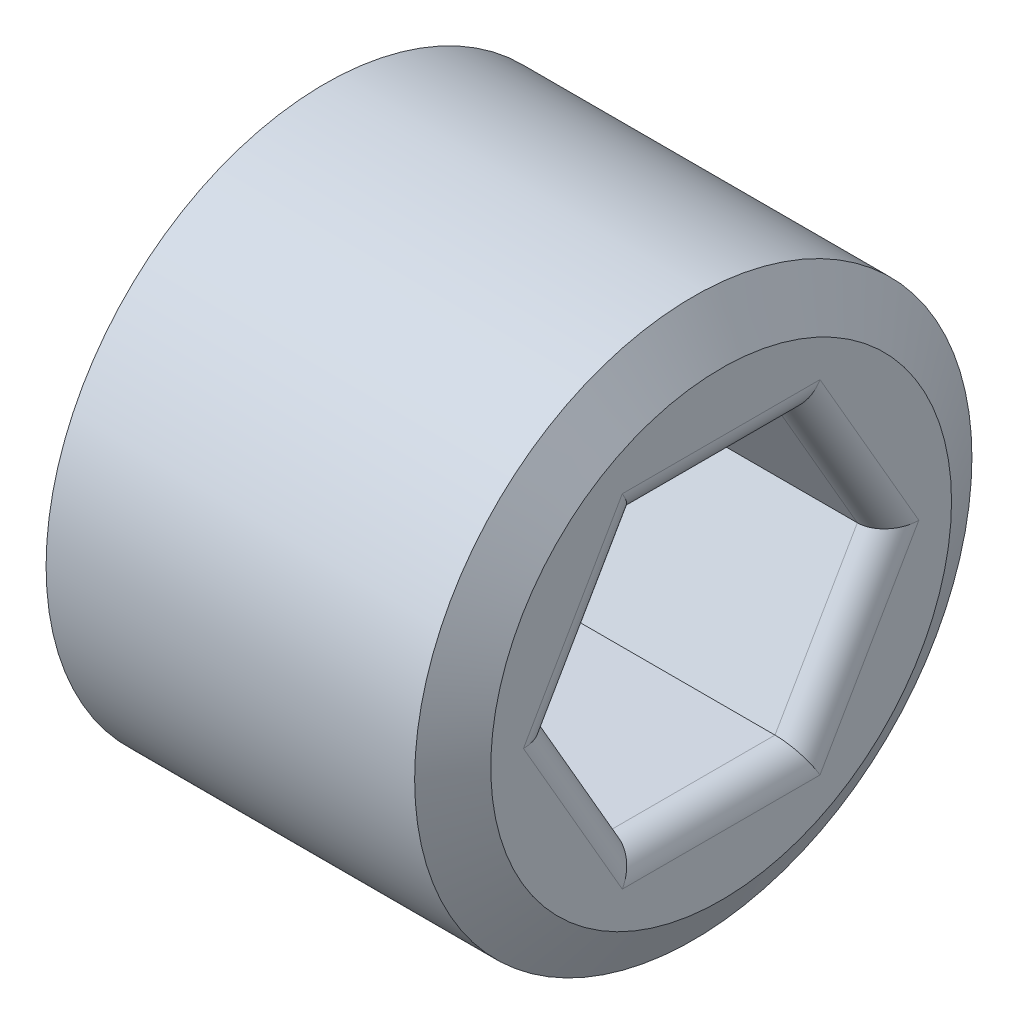
ISO-10303-21;
HEADER;
FILE_DESCRIPTION(('STEP AP214'),'2;1');
FILE_NAME('part.step','',(''),(''),'','','');
FILE_SCHEMA(('AUTOMOTIVE_DESIGN { 1 0 10303 214 1 1 1 1 }'));
ENDSEC;
DATA;
#1=APPLICATION_CONTEXT('core data for automotive mechanical design processes');
#2=APPLICATION_PROTOCOL_DEFINITION('international standard','automotive_design',2000,#1);
#3=PRODUCT_CONTEXT('',#1,'mechanical');
#4=PRODUCT('Part','Part','',(#3));
#5=PRODUCT_RELATED_PRODUCT_CATEGORY('part','',(#4));
#6=PRODUCT_DEFINITION_FORMATION('','',#4);
#7=PRODUCT_DEFINITION_CONTEXT('part definition',#1,'design');
#8=PRODUCT_DEFINITION('design','',#6,#7);
#9=PRODUCT_DEFINITION_SHAPE('','',#8);
#10=(LENGTH_UNIT() NAMED_UNIT(*) SI_UNIT(.MILLI.,.METRE.));
#11=(NAMED_UNIT(*) PLANE_ANGLE_UNIT() SI_UNIT($,.RADIAN.));
#12=(NAMED_UNIT(*) SI_UNIT($,.STERADIAN.) SOLID_ANGLE_UNIT());
#13=UNCERTAINTY_MEASURE_WITH_UNIT(LENGTH_MEASURE(1.E-05),#10,'distance_accuracy_value','');
#14=(GEOMETRIC_REPRESENTATION_CONTEXT(3) GLOBAL_UNCERTAINTY_ASSIGNED_CONTEXT((#13)) GLOBAL_UNIT_ASSIGNED_CONTEXT((#10,
#11,#12)) REPRESENTATION_CONTEXT('',''));
#15=CARTESIAN_POINT('',(0.,0.,0.));
#16=DIRECTION('',(0.,0.,1.));
#17=DIRECTION('',(1.,0.,0.));
#18=AXIS2_PLACEMENT_3D('',#15,#16,#17);
#19=CARTESIAN_POINT('',(2.573333333333,-0.64,0.));
#20=DIRECTION('',(-0.832050294337844,-0.554700196225229,0.));
#21=DIRECTION('',(-0.554700196225229,0.832050294337844,0.));
#22=AXIS2_PLACEMENT_3D('',#19,#20,#21);
#23=PLANE('',#22);
#24=DIRECTION('',(0.500000000000009,-0.750000000000026,0.433012701892163));
#25=VECTOR('',#24,1.);
#26=CARTESIAN_POINT('',(2.14666666666653,-1.58130886857011E-13,2.7414051931296E-13));
#27=LINE('',#26,#25);
#28=CARTESIAN_POINT('',(2.14666666666652,1.02487120072585E-13,0.));
#29=VERTEX_POINT('',#28);
#30=CARTESIAN_POINT('',(2.99999999999995,-1.27999999999992,0.73900834456256));
#31=VERTEX_POINT('',#30);
#32=EDGE_CURVE('E11',#29,#31,#27,.T.);
#33=ORIENTED_EDGE('',*,*,#32,.T.);
#34=DIRECTION('',(0.,0.,-1.));
#35=VECTOR('',#34,1.);
#36=CARTESIAN_POINT('',(3.,-1.28,0.7390083445627));
#37=LINE('',#36,#35);
#38=CARTESIAN_POINT('',(2.99999999999995,-1.28000000000002,-0.739008344562731));
#39=VERTEX_POINT('',#38);
#40=EDGE_CURVE('E206',#31,#39,#37,.T.);
#41=ORIENTED_EDGE('',*,*,#40,.T.);
#42=DIRECTION('',(-0.500000000000009,0.750000000000026,0.433012701892163));
#43=VECTOR('',#42,1.);
#44=CARTESIAN_POINT('',(2.99999999999979,-1.28000000000007,-0.739008344562823));
#45=LINE('',#44,#43);
#46=EDGE_CURVE('E28',#39,#29,#45,.T.);
#47=ORIENTED_EDGE('',*,*,#46,.T.);
#48=EDGE_LOOP('',(#33,#41,#47));
#49=FACE_BOUND('',#48,.T.);
#50=ADVANCED_FACE('F17',(#49),#23,.F.);
#51=CARTESIAN_POINT('',(2.573333333333,-0.32,0.554256258422));
#52=DIRECTION('',(-0.832050294337818,-0.277350098112606,0.480384461415311));
#53=DIRECTION('',(-0.316227766016838,0.948683298050514,0.));
#54=AXIS2_PLACEMENT_3D('',#51,#52,#53);
#55=PLANE('',#54);
#56=DIRECTION('',(0.50000000000005,0.,0.86602540378441));
#57=VECTOR('',#56,1.);
#58=CARTESIAN_POINT('',(2.49333333333304,1.58130886857011E-13,0.60044427995715));
#59=LINE('',#58,#57);
#60=CARTESIAN_POINT('',(2.99999999999991,2.11348731884399E-13,1.47801668912526));
#61=VERTEX_POINT('',#60);
#62=EDGE_CURVE('E203',#29,#61,#59,.T.);
#63=ORIENTED_EDGE('',*,*,#62,.T.);
#64=DIRECTION('',(0.,-0.866025403784429,-0.500000000000017));
#65=VECTOR('',#64,1.);
#66=CARTESIAN_POINT('',(3.,0.,1.478016689125));
#67=LINE('',#66,#65);
#68=EDGE_CURVE('E207',#61,#31,#67,.T.);
#69=ORIENTED_EDGE('',*,*,#68,.T.);
#70=ORIENTED_EDGE('',*,*,#32,.F.);
#71=EDGE_LOOP('',(#63,#69,#70));
#72=FACE_BOUND('',#71,.T.);
#73=ADVANCED_FACE('F377',(#72),#55,.F.);
#74=CARTESIAN_POINT('',(2.573333333333,-0.32,-0.554256258422));
#75=DIRECTION('',(-0.832050294337818,-0.277350098112606,-0.480384461415311));
#76=DIRECTION('',(-0.50000000000005,0.,0.86602540378441));
#77=AXIS2_PLACEMENT_3D('',#74,#75,#76);
#78=PLANE('',#77);
#79=ORIENTED_EDGE('',*,*,#46,.F.);
#80=DIRECTION('',(0.,0.866025403784429,-0.500000000000017));
#81=VECTOR('',#80,1.);
#82=CARTESIAN_POINT('',(3.,-1.28,-0.7390083445627));
#83=LINE('',#82,#81);
#84=CARTESIAN_POINT('',(2.99999999999991,0.,-1.47801668912513));
#85=VERTEX_POINT('',#84);
#86=EDGE_CURVE('E213',#39,#85,#83,.T.);
#87=ORIENTED_EDGE('',*,*,#86,.T.);
#88=DIRECTION('',(-0.50000000000005,0.,0.86602540378441));
#89=VECTOR('',#88,1.);
#90=CARTESIAN_POINT('',(2.49333333333303,1.13949648328227E-13,-0.600444279957157));
#91=LINE('',#90,#89);
#92=EDGE_CURVE('E212',#85,#29,#91,.T.);
#93=ORIENTED_EDGE('',*,*,#92,.T.);
#94=EDGE_LOOP('',(#79,#87,#93));
#95=FACE_BOUND('',#94,.T.);
#96=ADVANCED_FACE('F371',(#95),#78,.F.);
#97=CARTESIAN_POINT('',(3.,-1.28,0.7390083445627));
#98=DIRECTION('',(0.,-1.,0.));
#99=DIRECTION('',(0.,0.,-1.));
#100=AXIS2_PLACEMENT_3D('',#97,#98,#99);
#101=PLANE('',#100);
#102=DIRECTION('',(0.,0.,1.));
#103=VECTOR('',#102,1.);
#104=CARTESIAN_POINT('',(4.744,-1.28,0.7390083445627));
#105=LINE('',#104,#103);
#106=CARTESIAN_POINT('',(4.744,-1.27999999999997,-0.739008344562715));
#107=VERTEX_POINT('',#106);
#108=CARTESIAN_POINT('',(4.744,-1.27999999999961,0.739008344562473));
#109=VERTEX_POINT('',#108);
#110=EDGE_CURVE('E217',#107,#109,#105,.T.);
#111=ORIENTED_EDGE('',*,*,#110,.F.);
#112=DIRECTION('',(-1.,0.,0.));
#113=VECTOR('',#112,1.);
#114=CARTESIAN_POINT('',(3.,-1.28,-0.7390083445627));
#115=LINE('',#114,#113);
#116=EDGE_CURVE('E208',#107,#39,#115,.T.);
#117=ORIENTED_EDGE('',*,*,#116,.T.);
#118=ORIENTED_EDGE('',*,*,#40,.F.);
#119=DIRECTION('',(1.,0.,0.));
#120=VECTOR('',#119,1.);
#121=CARTESIAN_POINT('',(3.,-1.2799999999998,0.73900834456236));
#122=LINE('',#121,#120);
#123=EDGE_CURVE('E21',#31,#109,#122,.T.);
#124=ORIENTED_EDGE('',*,*,#123,.T.);
#125=EDGE_LOOP('',(#111,#117,#118,#124));
#126=FACE_BOUND('',#125,.T.);
#127=ADVANCED_FACE('F376',(#126),#101,.F.);
#128=CARTESIAN_POINT('',(2.573333333333,0.32,0.554256258422));
#129=DIRECTION('',(-0.832050294337818,0.277350098112606,0.480384461415311));
#130=DIRECTION('',(0.316227766016838,0.948683298050514,0.));
#131=AXIS2_PLACEMENT_3D('',#128,#129,#130);
#132=PLANE('',#131);
#133=DIRECTION('',(0.499999999999991,0.749999999999987,0.433012701892252));
#134=VECTOR('',#133,1.);
#135=CARTESIAN_POINT('',(2.14666666666654,3.07588156334138E-13,0.));
#136=LINE('',#135,#134);
#137=CARTESIAN_POINT('',(2.99999999999994,1.28000000000004,0.7390083445627));
#138=VERTEX_POINT('',#137);
#139=EDGE_CURVE('E220',#29,#138,#136,.T.);
#140=ORIENTED_EDGE('',*,*,#139,.T.);
#141=DIRECTION('',(0.,-0.866025403784429,0.500000000000017));
#142=VECTOR('',#141,1.);
#143=CARTESIAN_POINT('',(3.,1.28,0.7390083445627));
#144=LINE('',#143,#142);
#145=EDGE_CURVE('E186',#138,#61,#144,.T.);
#146=ORIENTED_EDGE('',*,*,#145,.T.);
#147=ORIENTED_EDGE('',*,*,#62,.F.);
#148=EDGE_LOOP('',(#140,#146,#147));
#149=FACE_BOUND('',#148,.T.);
#150=ADVANCED_FACE('F390',(#149),#132,.F.);
#151=CARTESIAN_POINT('',(3.,0.,1.478016689125));
#152=DIRECTION('',(0.,-0.500000000000017,0.866025403784429));
#153=DIRECTION('',(-1.,0.,0.));
#154=AXIS2_PLACEMENT_3D('',#151,#152,#153);
#155=PLANE('',#154);
#156=DIRECTION('',(0.,0.866025403784429,0.500000000000017));
#157=VECTOR('',#156,1.);
#158=CARTESIAN_POINT('',(4.744,0.,1.478016689125));
#159=LINE('',#158,#157);
#160=CARTESIAN_POINT('',(4.744,-3.42442614625508E-13,1.47801668912526));
#161=VERTEX_POINT('',#160);
#162=EDGE_CURVE('E198',#109,#161,#159,.T.);
#163=ORIENTED_EDGE('',*,*,#162,.F.);
#164=ORIENTED_EDGE('',*,*,#123,.F.);
#165=ORIENTED_EDGE('',*,*,#68,.F.);
#166=DIRECTION('',(1.,0.,0.));
#167=VECTOR('',#166,1.);
#168=CARTESIAN_POINT('',(3.,1.96457433654373E-13,1.47801668912534));
#169=LINE('',#168,#167);
#170=EDGE_CURVE('E182',#61,#161,#169,.T.);
#171=ORIENTED_EDGE('',*,*,#170,.T.);
#172=EDGE_LOOP('',(#163,#164,#165,#171));
#173=FACE_BOUND('',#172,.T.);
#174=ADVANCED_FACE('F384',(#173),#155,.F.);
#175=CARTESIAN_POINT('',(2.573333333333,0.32,-0.554256258422));
#176=DIRECTION('',(-0.832050294337818,0.277350098112606,-0.480384461415311));
#177=DIRECTION('',(-0.50000000000005,0.,0.86602540378441));
#178=AXIS2_PLACEMENT_3D('',#175,#176,#177);
#179=PLANE('',#178);
#180=ORIENTED_EDGE('',*,*,#92,.F.);
#181=DIRECTION('',(0.,0.866025403784429,0.500000000000017));
#182=VECTOR('',#181,1.);
#183=CARTESIAN_POINT('',(3.,0.,-1.478016689125));
#184=LINE('',#183,#182);
#185=CARTESIAN_POINT('',(2.99999999999994,1.28,-0.739008344562615));
#186=VERTEX_POINT('',#185);
#187=EDGE_CURVE('E263',#85,#186,#184,.T.);
#188=ORIENTED_EDGE('',*,*,#187,.T.);
#189=DIRECTION('',(-0.499999999999991,-0.749999999999987,0.433012701892252));
#190=VECTOR('',#189,1.);
#191=CARTESIAN_POINT('',(2.99999999999977,1.28000000000015,-0.7390083445627));
#192=LINE('',#191,#190);
#193=EDGE_CURVE('E196',#186,#29,#192,.T.);
#194=ORIENTED_EDGE('',*,*,#193,.T.);
#195=EDGE_LOOP('',(#180,#188,#194));
#196=FACE_BOUND('',#195,.T.);
#197=ADVANCED_FACE('F389',(#196),#179,.F.);
#198=CARTESIAN_POINT('',(3.,-1.28,-0.7390083445627));
#199=DIRECTION('',(0.,-0.500000000000017,-0.866025403784429));
#200=DIRECTION('',(0.,-0.866025403784429,0.500000000000017));
#201=AXIS2_PLACEMENT_3D('',#198,#199,#200);
#202=PLANE('',#201);
#203=DIRECTION('',(0.,-0.866025403784429,0.500000000000017));
#204=VECTOR('',#203,1.);
#205=CARTESIAN_POINT('',(4.744,-1.28,-0.7390083445627));
#206=LINE('',#205,#204);
#207=CARTESIAN_POINT('',(4.744,3.42442614625508E-13,-1.47801668912526));
#208=VERTEX_POINT('',#207);
#209=EDGE_CURVE('E188',#208,#107,#206,.T.);
#210=ORIENTED_EDGE('',*,*,#209,.F.);
#211=DIRECTION('',(-1.,0.,0.));
#212=VECTOR('',#211,1.);
#213=CARTESIAN_POINT('',(3.,0.,-1.478016689125));
#214=LINE('',#213,#212);
#215=EDGE_CURVE('E187',#208,#85,#214,.T.);
#216=ORIENTED_EDGE('',*,*,#215,.T.);
#217=ORIENTED_EDGE('',*,*,#86,.F.);
#218=ORIENTED_EDGE('',*,*,#116,.F.);
#219=EDGE_LOOP('',(#210,#216,#217,#218));
#220=FACE_BOUND('',#219,.T.);
#221=ADVANCED_FACE('F440',(#220),#202,.F.);
#222=CARTESIAN_POINT('',(2.573333333333,0.64,0.));
#223=DIRECTION('',(-0.832050294337844,0.554700196225229,0.));
#224=DIRECTION('',(0.,0.,1.));
#225=AXIS2_PLACEMENT_3D('',#222,#223,#224);
#226=PLANE('',#225);
#227=ORIENTED_EDGE('',*,*,#193,.F.);
#228=DIRECTION('',(0.,0.,1.));
#229=VECTOR('',#228,1.);
#230=CARTESIAN_POINT('',(3.,1.28,-0.7390083445627));
#231=LINE('',#230,#229);
#232=EDGE_CURVE('E176',#186,#138,#231,.T.);
#233=ORIENTED_EDGE('',*,*,#232,.T.);
#234=ORIENTED_EDGE('',*,*,#139,.F.);
#235=EDGE_LOOP('',(#227,#233,#234));
#236=FACE_BOUND('',#235,.T.);
#237=ADVANCED_FACE('F19',(#236),#226,.F.);
#238=CARTESIAN_POINT('',(3.,1.28,0.7390083445627));
#239=DIRECTION('',(0.,0.500000000000017,0.866025403784429));
#240=DIRECTION('',(1.,0.,0.));
#241=AXIS2_PLACEMENT_3D('',#238,#239,#240);
#242=PLANE('',#241);
#243=DIRECTION('',(0.,0.866025403784429,-0.500000000000017));
#244=VECTOR('',#243,1.);
#245=CARTESIAN_POINT('',(4.744,1.28,0.7390083445627));
#246=LINE('',#245,#244);
#247=CARTESIAN_POINT('',(4.744,1.27999999999997,0.739008344562715));
#248=VERTEX_POINT('',#247);
#249=EDGE_CURVE('E127',#161,#248,#246,.T.);
#250=ORIENTED_EDGE('',*,*,#249,.F.);
#251=ORIENTED_EDGE('',*,*,#170,.F.);
#252=ORIENTED_EDGE('',*,*,#145,.F.);
#253=DIRECTION('',(1.,0.,0.));
#254=VECTOR('',#253,1.);
#255=CARTESIAN_POINT('',(3.,1.28,0.7390083445627));
#256=LINE('',#255,#254);
#257=EDGE_CURVE('E181',#138,#248,#256,.T.);
#258=ORIENTED_EDGE('',*,*,#257,.T.);
#259=EDGE_LOOP('',(#250,#251,#252,#258));
#260=FACE_BOUND('',#259,.T.);
#261=ADVANCED_FACE('F412',(#260),#242,.F.);
#262=CARTESIAN_POINT('',(3.,0.,-1.478016689125));
#263=DIRECTION('',(0.,0.500000000000017,-0.866025403784429));
#264=DIRECTION('',(-1.,0.,0.));
#265=AXIS2_PLACEMENT_3D('',#262,#263,#264);
#266=PLANE('',#265);
#267=DIRECTION('',(0.,-0.866025403784429,-0.500000000000017));
#268=VECTOR('',#267,1.);
#269=CARTESIAN_POINT('',(4.744,0.,-1.478016689125));
#270=LINE('',#269,#268);
#271=CARTESIAN_POINT('',(4.744,1.27999999999961,-0.739008344562473));
#272=VERTEX_POINT('',#271);
#273=EDGE_CURVE('E192',#272,#208,#270,.T.);
#274=ORIENTED_EDGE('',*,*,#273,.F.);
#275=DIRECTION('',(-1.,0.,0.));
#276=VECTOR('',#275,1.);
#277=CARTESIAN_POINT('',(3.,1.28,-0.7390083445627));
#278=LINE('',#277,#276);
#279=EDGE_CURVE('E180',#272,#186,#278,.T.);
#280=ORIENTED_EDGE('',*,*,#279,.T.);
#281=ORIENTED_EDGE('',*,*,#187,.F.);
#282=ORIENTED_EDGE('',*,*,#215,.F.);
#283=EDGE_LOOP('',(#274,#280,#281,#282));
#284=FACE_BOUND('',#283,.T.);
#285=ADVANCED_FACE('F406',(#284),#266,.F.);
#286=CARTESIAN_POINT('',(3.,1.28,-0.7390083445627));
#287=DIRECTION('',(0.,1.,0.));
#288=DIRECTION('',(1.,0.,0.));
#289=AXIS2_PLACEMENT_3D('',#286,#287,#288);
#290=PLANE('',#289);
#291=DIRECTION('',(0.,0.,-1.));
#292=VECTOR('',#291,1.);
#293=CARTESIAN_POINT('',(4.744,1.28,-0.8868100134753));
#294=LINE('',#293,#292);
#295=EDGE_CURVE('E132',#248,#272,#294,.T.);
#296=ORIENTED_EDGE('',*,*,#295,.F.);
#297=ORIENTED_EDGE('',*,*,#257,.F.);
#298=ORIENTED_EDGE('',*,*,#232,.F.);
#299=ORIENTED_EDGE('',*,*,#279,.F.);
#300=EDGE_LOOP('',(#296,#297,#298,#299));
#301=FACE_BOUND('',#300,.T.);
#302=ADVANCED_FACE('F411',(#301),#290,.F.);
#303=CARTESIAN_POINT('',(4.744,0.,-1.773620026951));
#304=DIRECTION('',(0.,-0.866025403784429,-0.500000000000017));
#305=DIRECTION('',(0.,0.500000000000017,-0.866025403784429));
#306=AXIS2_PLACEMENT_3D('',#303,#304,#305);
#307=CYLINDRICAL_SURFACE('',#306,0.256);
#308=CARTESIAN_POINT('',(4.74399999999952,3.42442614625508E-13,-1.77362002695056));
#309=DIRECTION('',(0.,-1.,0.));
#310=DIRECTION('',(2.69310036024254E-12,0.,-1.));
#311=AXIS2_PLACEMENT_3D('',#308,#309,#310);
#312=ELLIPSE('',#311,0.295603337825302,0.256000000000483);
#313=CARTESIAN_POINT('',(5.,3.42442614625508E-13,-1.773620026951));
#314=VERTEX_POINT('',#313);
#315=EDGE_CURVE('E193',#314,#208,#312,.T.);
#316=ORIENTED_EDGE('',*,*,#315,.F.);
#317=DIRECTION('',(0.,-0.866025403784332,-0.500000000000184));
#318=VECTOR('',#317,1.);
#319=CARTESIAN_POINT('',(5.,1.536,-0.8868100134753));
#320=LINE('',#319,#318);
#321=CARTESIAN_POINT('',(5.,1.53599999999983,-0.886810013475399));
#322=VERTEX_POINT('',#321);
#323=EDGE_CURVE('E143',#322,#314,#320,.T.);
#324=ORIENTED_EDGE('',*,*,#323,.F.);
#325=CARTESIAN_POINT('',(4.74399999999927,1.53600000000007,-0.886810013474854));
#326=DIRECTION('',(2.32114647560384E-12,0.499999999998903,0.866025403785072));
#327=DIRECTION('',(-3.96290415707483E-12,-0.866025403785072,0.499999999998903));
#328=AXIS2_PLACEMENT_3D('',#325,#326,#327);
#329=ELLIPSE('',#328,0.29560333782541,0.256000000000731);
#330=EDGE_CURVE('E133',#272,#322,#329,.T.);
#331=ORIENTED_EDGE('',*,*,#330,.F.);
#332=ORIENTED_EDGE('',*,*,#273,.T.);
#333=EDGE_LOOP('',(#316,#324,#331,#332));
#334=FACE_BOUND('',#333,.T.);
#335=ADVANCED_FACE('F353',(#334),#307,.T.);
#336=CARTESIAN_POINT('',(4.744,-1.536,-0.8868100134753));
#337=DIRECTION('',(0.,-0.866025403784429,0.500000000000017));
#338=DIRECTION('',(0.,-0.500000000000017,-0.866025403784429));
#339=AXIS2_PLACEMENT_3D('',#336,#337,#338);
#340=CYLINDRICAL_SURFACE('',#339,0.256);
#341=CARTESIAN_POINT('',(4.74399999999993,-1.53600000000003,-0.886810013475275));
#342=DIRECTION('',(1.36665330226025E-13,-0.499999999999964,0.866025403784459));
#343=DIRECTION('',(0.,-0.866025403784459,-0.499999999999964));
#344=AXIS2_PLACEMENT_3D('',#341,#342,#343);
#345=ELLIPSE('',#344,0.295603337825142,0.256000000000075);
#346=CARTESIAN_POINT('',(5.,-1.536,-0.8868100134753));
#347=VERTEX_POINT('',#346);
#348=EDGE_CURVE('E201',#347,#107,#345,.T.);
#349=ORIENTED_EDGE('',*,*,#348,.F.);
#350=DIRECTION('',(0.,-0.866025403784333,0.500000000000184));
#351=VECTOR('',#350,1.);
#352=CARTESIAN_POINT('',(5.,0.,-1.773620026951));
#353=LINE('',#352,#351);
#354=EDGE_CURVE('E305',#314,#347,#353,.T.);
#355=ORIENTED_EDGE('',*,*,#354,.F.);
#356=ORIENTED_EDGE('',*,*,#315,.T.);
#357=ORIENTED_EDGE('',*,*,#209,.T.);
#358=EDGE_LOOP('',(#349,#355,#356,#357));
#359=FACE_BOUND('',#358,.T.);
#360=ADVANCED_FACE('F347',(#359),#340,.T.);
#361=CARTESIAN_POINT('',(4.744,-1.536,0.8868100134753));
#362=DIRECTION('',(0.,0.,1.));
#363=DIRECTION('',(1.,0.,0.));
#364=AXIS2_PLACEMENT_3D('',#361,#362,#363);
#365=CYLINDRICAL_SURFACE('',#364,0.256);
#366=CARTESIAN_POINT('',(4.74399999999924,-1.536,0.886810013475075));
#367=DIRECTION('',(-2.08038609575042E-12,0.499999999999584,0.866025403784679));
#368=DIRECTION('',(3.60837204286304E-12,-0.866025403784679,0.499999999999584));
#369=AXIS2_PLACEMENT_3D('',#366,#367,#368);
#370=ELLIPSE('',#369,0.295603337825449,0.256000000000759);
#371=CARTESIAN_POINT('',(5.,-1.53599999999983,0.886810013475597));
#372=VERTEX_POINT('',#371);
#373=EDGE_CURVE('E202',#372,#109,#370,.T.);
#374=ORIENTED_EDGE('',*,*,#373,.F.);
#375=DIRECTION('',(0.,0.,1.));
#376=VECTOR('',#375,1.);
#377=CARTESIAN_POINT('',(5.,-1.536,0.));
#378=LINE('',#377,#376);
#379=EDGE_CURVE('E160',#347,#372,#378,.T.);
#380=ORIENTED_EDGE('',*,*,#379,.F.);
#381=ORIENTED_EDGE('',*,*,#348,.T.);
#382=ORIENTED_EDGE('',*,*,#110,.T.);
#383=EDGE_LOOP('',(#374,#380,#381,#382));
#384=FACE_BOUND('',#383,.T.);
#385=ADVANCED_FACE('F352',(#384),#365,.T.);
#386=CARTESIAN_POINT('',(4.744,0.,1.773620026951));
#387=DIRECTION('',(0.,0.866025403784429,0.500000000000017));
#388=DIRECTION('',(0.,-0.500000000000017,0.866025403784429));
#389=AXIS2_PLACEMENT_3D('',#386,#387,#388);
#390=CYLINDRICAL_SURFACE('',#389,0.256);
#391=CARTESIAN_POINT('',(4.74399999999952,-3.42442614625508E-13,1.77362002695056));
#392=DIRECTION('',(0.,1.,0.));
#393=DIRECTION('',(2.69310036024254E-12,0.,1.));
#394=AXIS2_PLACEMENT_3D('',#391,#392,#393);
#395=ELLIPSE('',#394,0.295603337825302,0.256000000000483);
#396=CARTESIAN_POINT('',(5.,-3.42442614625508E-13,1.773620026951));
#397=VERTEX_POINT('',#396);
#398=EDGE_CURVE('E111',#397,#161,#395,.T.);
#399=ORIENTED_EDGE('',*,*,#398,.F.);
#400=DIRECTION('',(0.,0.866025403784333,0.500000000000184));
#401=VECTOR('',#400,1.);
#402=CARTESIAN_POINT('',(5.,-1.536,0.8868100134753));
#403=LINE('',#402,#401);
#404=EDGE_CURVE('E148',#372,#397,#403,.T.);
#405=ORIENTED_EDGE('',*,*,#404,.F.);
#406=ORIENTED_EDGE('',*,*,#373,.T.);
#407=ORIENTED_EDGE('',*,*,#162,.T.);
#408=EDGE_LOOP('',(#399,#405,#406,#407));
#409=FACE_BOUND('',#408,.T.);
#410=ADVANCED_FACE('F496',(#409),#390,.T.);
#411=CARTESIAN_POINT('',(4.744,1.536,0.8868100134753));
#412=DIRECTION('',(0.,0.866025403784429,-0.500000000000017));
#413=DIRECTION('',(0.,0.500000000000017,0.866025403784429));
#414=AXIS2_PLACEMENT_3D('',#411,#412,#413);
#415=CYLINDRICAL_SURFACE('',#414,0.256);
#416=CARTESIAN_POINT('',(4.74399999999993,1.53600000000003,0.886810013475275));
#417=DIRECTION('',(1.36665330226025E-13,0.499999999999964,-0.866025403784459));
#418=DIRECTION('',(0.,0.866025403784459,0.499999999999964));
#419=AXIS2_PLACEMENT_3D('',#416,#417,#418);
#420=ELLIPSE('',#419,0.295603337825142,0.256000000000075);
#421=CARTESIAN_POINT('',(5.,1.536,0.8868100134753));
#422=VERTEX_POINT('',#421);
#423=EDGE_CURVE('E120',#422,#248,#420,.T.);
#424=ORIENTED_EDGE('',*,*,#423,.F.);
#425=DIRECTION('',(0.,0.866025403784333,-0.500000000000184));
#426=VECTOR('',#425,1.);
#427=CARTESIAN_POINT('',(5.,0.,1.773620026951));
#428=LINE('',#427,#426);
#429=EDGE_CURVE('E124',#397,#422,#428,.T.);
#430=ORIENTED_EDGE('',*,*,#429,.F.);
#431=ORIENTED_EDGE('',*,*,#398,.T.);
#432=ORIENTED_EDGE('',*,*,#249,.T.);
#433=EDGE_LOOP('',(#424,#430,#431,#432));
#434=FACE_BOUND('',#433,.T.);
#435=ADVANCED_FACE('F122',(#434),#415,.T.);
#436=CARTESIAN_POINT('',(4.744,1.536,-0.8868100134753));
#437=DIRECTION('',(0.,0.,-1.));
#438=DIRECTION('',(-1.,0.,0.));
#439=AXIS2_PLACEMENT_3D('',#436,#437,#438);
#440=CYLINDRICAL_SURFACE('',#439,0.256);
#441=ORIENTED_EDGE('',*,*,#330,.T.);
#442=DIRECTION('',(0.,0.,-1.));
#443=VECTOR('',#442,1.);
#444=CARTESIAN_POINT('',(5.,1.536,0.));
#445=LINE('',#444,#443);
#446=EDGE_CURVE('E136',#422,#322,#445,.T.);
#447=ORIENTED_EDGE('',*,*,#446,.F.);
#448=ORIENTED_EDGE('',*,*,#423,.T.);
#449=ORIENTED_EDGE('',*,*,#295,.T.);
#450=EDGE_LOOP('',(#441,#447,#448,#449));
#451=FACE_BOUND('',#450,.T.);
#452=ADVANCED_FACE('F137',(#451),#440,.T.);
#453=CARTESIAN_POINT('',(5.,0.,0.));
#454=DIRECTION('',(1.,0.,0.));
#455=DIRECTION('',(0.,1.,0.));
#456=AXIS2_PLACEMENT_3D('',#453,#454,#455);
#457=PLANE('',#456);
#458=ORIENTED_EDGE('',*,*,#429,.T.);
#459=ORIENTED_EDGE('',*,*,#446,.T.);
#460=ORIENTED_EDGE('',*,*,#323,.T.);
#461=ORIENTED_EDGE('',*,*,#354,.T.);
#462=ORIENTED_EDGE('',*,*,#379,.T.);
#463=ORIENTED_EDGE('',*,*,#404,.T.);
#464=EDGE_LOOP('',(#458,#459,#460,#461,#462,#463));
#465=FACE_BOUND('',#464,.T.);
#466=CARTESIAN_POINT('',(4.99999999993861,0.,0.));
#467=DIRECTION('',(-1.,0.,0.));
#468=DIRECTION('',(0.,0.,1.));
#469=AXIS2_PLACEMENT_3D('',#466,#467,#468);
#470=CIRCLE('',#469,2.06700000001092);
#471=CARTESIAN_POINT('',(4.99999999993861,0.,-2.06700000001092));
#472=VERTEX_POINT('',#471);
#473=EDGE_CURVE('E150',#472,#472,#470,.T.);
#474=ORIENTED_EDGE('',*,*,#473,.F.);
#475=EDGE_LOOP('',(#474));
#476=FACE_BOUND('',#475,.T.);
#477=ADVANCED_FACE('F145',(#465,#476),#457,.T.);
#478=CARTESIAN_POINT('',(4.75000733337083,0.,0.));
#479=DIRECTION('',(-1.,0.,0.));
#480=DIRECTION('',(0.,0.,1.));
#481=AXIS2_PLACEMENT_3D('',#478,#479,#480);
#482=CONICAL_SURFACE('',#481,2.49999999999773,1.04719755116839);
#483=CARTESIAN_POINT('',(4.750007333441,0.,0.));
#484=DIRECTION('',(-1.,0.,0.));
#485=DIRECTION('',(0.,0.,-1.));
#486=AXIS2_PLACEMENT_3D('',#483,#484,#485);
#487=CIRCLE('',#486,2.5);
#488=CARTESIAN_POINT('',(4.750007333441,0.,-2.49999999987619));
#489=VERTEX_POINT('',#488);
#490=CARTESIAN_POINT('',(4.750007333441,0.,2.5));
#491=VERTEX_POINT('',#490);
#492=EDGE_CURVE('E167',#489,#491,#487,.T.);
#493=ORIENTED_EDGE('',*,*,#492,.F.);
#494=DIRECTION('',(0.500000000024432,0.,0.866025403770333));
#495=VECTOR('',#494,1.);
#496=CARTESIAN_POINT('',(4.75000733337083,0.,-2.49999999999773));
#497=LINE('',#496,#495);
#498=EDGE_CURVE('E156',#489,#472,#497,.T.);
#499=ORIENTED_EDGE('',*,*,#498,.T.);
#500=ORIENTED_EDGE('',*,*,#473,.T.);
#501=ORIENTED_EDGE('',*,*,#498,.F.);
#502=CARTESIAN_POINT('',(4.750007333441,0.,0.));
#503=DIRECTION('',(-1.,0.,0.));
#504=DIRECTION('',(0.,0.,-1.));
#505=AXIS2_PLACEMENT_3D('',#502,#503,#504);
#506=CIRCLE('',#505,2.5);
#507=EDGE_CURVE('E250',#491,#489,#506,.T.);
#508=ORIENTED_EDGE('',*,*,#507,.F.);
#509=EDGE_LOOP('',(#493,#499,#500,#501,#508));
#510=FACE_BOUND('',#509,.T.);
#511=ADVANCED_FACE('F467',(#510),#482,.T.);
#512=CARTESIAN_POINT('',(1.44337567297725,0.,0.));
#513=DIRECTION('',(1.,0.,0.));
#514=DIRECTION('',(0.,0.,-1.));
#515=AXIS2_PLACEMENT_3D('',#512,#513,#514);
#516=CONICAL_SURFACE('',#515,2.50000000005457,1.04719755117819);
#517=CARTESIAN_POINT('',(1.443375672974,0.,0.));
#518=DIRECTION('',(1.,0.,0.));
#519=DIRECTION('',(0.,0.,-1.));
#520=AXIS2_PLACEMENT_3D('',#517,#518,#519);
#521=CIRCLE('',#520,2.5);
#522=CARTESIAN_POINT('',(1.443375672974,0.,2.5));
#523=VERTEX_POINT('',#522);
#524=EDGE_CURVE('E166',#523,#523,#521,.T.);
#525=ORIENTED_EDGE('',*,*,#524,.F.);
#526=DIRECTION('',(-0.500000000015938,0.,-0.866025403775237));
#527=VECTOR('',#526,1.);
#528=CARTESIAN_POINT('',(1.44337567297725,0.,2.50000000005457));
#529=LINE('',#528,#527);
#530=CARTESIAN_POINT('',(0.,0.,0.));
#531=VERTEX_POINT('',#530);
#532=EDGE_CURVE('E231',#523,#531,#529,.T.);
#533=ORIENTED_EDGE('',*,*,#532,.T.);
#534=ORIENTED_EDGE('',*,*,#532,.F.);
#535=EDGE_LOOP('',(#525,#533,#534));
#536=FACE_BOUND('',#535,.T.);
#537=ADVANCED_FACE('F365',(#536),#516,.T.);
#538=CARTESIAN_POINT('',(-0.25,0.,0.));
#539=DIRECTION('',(1.,0.,0.));
#540=DIRECTION('',(0.,0.,-1.));
#541=AXIS2_PLACEMENT_3D('',#538,#539,#540);
#542=CYLINDRICAL_SURFACE('',#541,2.5);
#543=ORIENTED_EDGE('',*,*,#492,.T.);
#544=DIRECTION('',(-1.,0.,0.));
#545=VECTOR('',#544,1.);
#546=CARTESIAN_POINT('',(-0.25,0.,2.5));
#547=LINE('',#546,#545);
#548=EDGE_CURVE('E162',#491,#523,#547,.T.);
#549=ORIENTED_EDGE('',*,*,#548,.T.);
#550=ORIENTED_EDGE('',*,*,#524,.T.);
#551=ORIENTED_EDGE('',*,*,#548,.F.);
#552=ORIENTED_EDGE('',*,*,#507,.T.);
#553=EDGE_LOOP('',(#543,#549,#550,#551,#552));
#554=FACE_BOUND('',#553,.T.);
#555=ADVANCED_FACE('F360',(#554),#542,.T.);
#556=CLOSED_SHELL('',(#50,#73,#96,#127,#150,#174,#197,#221,#237,#261,#285,#302,#335,#360,#385,
#410,#435,#452,#477,#511,#537,#555));
#557=MANIFOLD_SOLID_BREP('B1',#556);
#558=ADVANCED_BREP_SHAPE_REPRESENTATION('',(#18,#557),#14);
#559=SHAPE_DEFINITION_REPRESENTATION(#9,#558);
ENDSEC;
END-ISO-10303-21;
